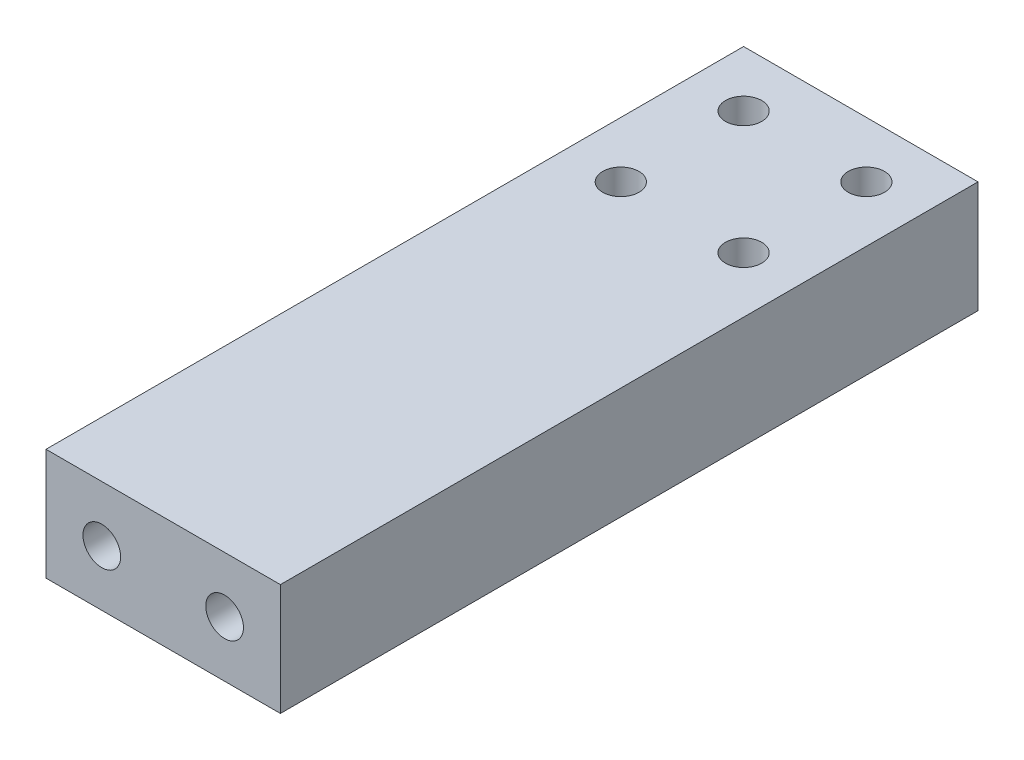
ISO-10303-21;
HEADER;
FILE_DESCRIPTION(('STEP AP214'),'2;1');
FILE_NAME('part.step','',(''),(''),'','','');
FILE_SCHEMA(('AUTOMOTIVE_DESIGN { 1 0 10303 214 1 1 1 1 }'));
ENDSEC;
DATA;
#1=APPLICATION_CONTEXT('core data for automotive mechanical design processes');
#2=APPLICATION_PROTOCOL_DEFINITION('international standard','automotive_design',2000,#1);
#3=PRODUCT_CONTEXT('',#1,'mechanical');
#4=PRODUCT('Part','Part','',(#3));
#5=PRODUCT_RELATED_PRODUCT_CATEGORY('part','',(#4));
#6=PRODUCT_DEFINITION_FORMATION('','',#4);
#7=PRODUCT_DEFINITION_CONTEXT('part definition',#1,'design');
#8=PRODUCT_DEFINITION('design','',#6,#7);
#9=PRODUCT_DEFINITION_SHAPE('','',#8);
#10=(LENGTH_UNIT() NAMED_UNIT(*) SI_UNIT(.MILLI.,.METRE.));
#11=(NAMED_UNIT(*) PLANE_ANGLE_UNIT() SI_UNIT($,.RADIAN.));
#12=(NAMED_UNIT(*) SI_UNIT($,.STERADIAN.) SOLID_ANGLE_UNIT());
#13=UNCERTAINTY_MEASURE_WITH_UNIT(LENGTH_MEASURE(1.E-05),#10,'distance_accuracy_value','');
#14=(GEOMETRIC_REPRESENTATION_CONTEXT(3) GLOBAL_UNCERTAINTY_ASSIGNED_CONTEXT((#13)) GLOBAL_UNIT_ASSIGNED_CONTEXT((#10,
#11,#12)) REPRESENTATION_CONTEXT('',''));
#15=CARTESIAN_POINT('',(0.,0.,0.));
#16=DIRECTION('',(0.,0.,1.));
#17=DIRECTION('',(1.,0.,0.));
#18=AXIS2_PLACEMENT_3D('',#15,#16,#17);
#19=CARTESIAN_POINT('',(0.,0.,125.));
#20=DIRECTION('',(1.,0.,0.));
#21=DIRECTION('',(0.,0.,-1.));
#22=AXIS2_PLACEMENT_3D('',#19,#20,#21);
#23=PLANE('',#22);
#24=DIRECTION('',(0.,-1.,0.));
#25=VECTOR('',#24,1.);
#26=CARTESIAN_POINT('',(0.,0.,0.));
#27=LINE('',#26,#25);
#28=CARTESIAN_POINT('',(0.,20.,0.));
#29=VERTEX_POINT('',#28);
#30=CARTESIAN_POINT('',(0.,0.,0.));
#31=VERTEX_POINT('',#30);
#32=EDGE_CURVE('E77',#29,#31,#27,.T.);
#33=ORIENTED_EDGE('',*,*,#32,.T.);
#34=DIRECTION('',(0.,0.,-1.));
#35=VECTOR('',#34,1.);
#36=CARTESIAN_POINT('',(0.,0.,125.));
#37=LINE('',#36,#35);
#38=CARTESIAN_POINT('',(0.,0.,125.));
#39=VERTEX_POINT('',#38);
#40=EDGE_CURVE('E11',#39,#31,#37,.T.);
#41=ORIENTED_EDGE('',*,*,#40,.F.);
#42=DIRECTION('',(0.,-1.,0.));
#43=VECTOR('',#42,1.);
#44=CARTESIAN_POINT('',(0.,0.,125.));
#45=LINE('',#44,#43);
#46=CARTESIAN_POINT('',(0.,20.,125.));
#47=VERTEX_POINT('',#46);
#48=EDGE_CURVE('E100',#47,#39,#45,.T.);
#49=ORIENTED_EDGE('',*,*,#48,.F.);
#50=DIRECTION('',(0.,0.,-1.));
#51=VECTOR('',#50,1.);
#52=CARTESIAN_POINT('',(0.,20.,125.));
#53=LINE('',#52,#51);
#54=EDGE_CURVE('E89',#47,#29,#53,.T.);
#55=ORIENTED_EDGE('',*,*,#54,.T.);
#56=EDGE_LOOP('',(#33,#41,#49,#55));
#57=FACE_BOUND('',#56,.T.);
#58=ADVANCED_FACE('F33',(#57),#23,.F.);
#59=CARTESIAN_POINT('',(0.,0.,125.));
#60=DIRECTION('',(0.,1.,0.));
#61=DIRECTION('',(0.,0.,1.));
#62=AXIS2_PLACEMENT_3D('',#59,#60,#61);
#63=PLANE('',#62);
#64=CARTESIAN_POINT('',(32.0000000000001,0.,31.9999999999998));
#65=DIRECTION('',(0.,1.,0.));
#66=DIRECTION('',(0.,0.,1.));
#67=AXIS2_PLACEMENT_3D('',#64,#65,#66);
#68=CIRCLE('',#67,3.25);
#69=CARTESIAN_POINT('',(32.0000000000001,0.,35.2499999999998));
#70=VERTEX_POINT('',#69);
#71=EDGE_CURVE('E138',#70,#70,#68,.F.);
#72=ORIENTED_EDGE('',*,*,#71,.F.);
#73=EDGE_LOOP('',(#72));
#74=FACE_BOUND('',#73,.T.);
#75=CARTESIAN_POINT('',(10.0000000000001,0.,32.));
#76=DIRECTION('',(0.,1.,0.));
#77=DIRECTION('',(0.,0.,1.));
#78=AXIS2_PLACEMENT_3D('',#75,#76,#77);
#79=CIRCLE('',#78,3.25);
#80=CARTESIAN_POINT('',(10.0000000000001,0.,35.25));
#81=VERTEX_POINT('',#80);
#82=EDGE_CURVE('E142',#81,#81,#79,.F.);
#83=ORIENTED_EDGE('',*,*,#82,.F.);
#84=EDGE_LOOP('',(#83));
#85=FACE_BOUND('',#84,.T.);
#86=CARTESIAN_POINT('',(32.,0.,9.99999999999984));
#87=DIRECTION('',(0.,1.,0.));
#88=DIRECTION('',(0.,0.,1.));
#89=AXIS2_PLACEMENT_3D('',#86,#87,#88);
#90=CIRCLE('',#89,3.25);
#91=CARTESIAN_POINT('',(32.,0.,13.2499999999998));
#92=VERTEX_POINT('',#91);
#93=EDGE_CURVE('E146',#92,#92,#90,.F.);
#94=ORIENTED_EDGE('',*,*,#93,.F.);
#95=EDGE_LOOP('',(#94));
#96=FACE_BOUND('',#95,.T.);
#97=CARTESIAN_POINT('',(10.,0.,9.99999999999999));
#98=DIRECTION('',(0.,1.,0.));
#99=DIRECTION('',(0.,0.,1.));
#100=AXIS2_PLACEMENT_3D('',#97,#98,#99);
#101=CIRCLE('',#100,3.25);
#102=CARTESIAN_POINT('',(10.,0.,13.25));
#103=VERTEX_POINT('',#102);
#104=EDGE_CURVE('E90',#103,#103,#101,.F.);
#105=ORIENTED_EDGE('',*,*,#104,.F.);
#106=EDGE_LOOP('',(#105));
#107=FACE_BOUND('',#106,.T.);
#108=DIRECTION('',(1.,0.,0.));
#109=VECTOR('',#108,1.);
#110=CARTESIAN_POINT('',(0.,0.,0.));
#111=LINE('',#110,#109);
#112=CARTESIAN_POINT('',(42.,0.,0.));
#113=VERTEX_POINT('',#112);
#114=EDGE_CURVE('E73',#31,#113,#111,.T.);
#115=ORIENTED_EDGE('',*,*,#114,.T.);
#116=DIRECTION('',(0.,0.,-1.));
#117=VECTOR('',#116,1.);
#118=CARTESIAN_POINT('',(42.,0.,125.));
#119=LINE('',#118,#117);
#120=CARTESIAN_POINT('',(42.,0.,125.));
#121=VERTEX_POINT('',#120);
#122=EDGE_CURVE('E40',#121,#113,#119,.T.);
#123=ORIENTED_EDGE('',*,*,#122,.F.);
#124=DIRECTION('',(1.,0.,0.));
#125=VECTOR('',#124,1.);
#126=CARTESIAN_POINT('',(0.,0.,125.));
#127=LINE('',#126,#125);
#128=EDGE_CURVE('E85',#39,#121,#127,.T.);
#129=ORIENTED_EDGE('',*,*,#128,.F.);
#130=ORIENTED_EDGE('',*,*,#40,.T.);
#131=EDGE_LOOP('',(#115,#123,#129,#130));
#132=FACE_BOUND('',#131,.T.);
#133=ADVANCED_FACE('F84',(#74,#85,#96,#107,#132),#63,.F.);
#134=CARTESIAN_POINT('',(42.,0.,125.));
#135=DIRECTION('',(-1.,0.,0.));
#136=DIRECTION('',(0.,0.,1.));
#137=AXIS2_PLACEMENT_3D('',#134,#135,#136);
#138=PLANE('',#137);
#139=DIRECTION('',(0.,1.,0.));
#140=VECTOR('',#139,1.);
#141=CARTESIAN_POINT('',(42.,0.,0.));
#142=LINE('',#141,#140);
#143=CARTESIAN_POINT('',(42.,20.,0.));
#144=VERTEX_POINT('',#143);
#145=EDGE_CURVE('E78',#113,#144,#142,.T.);
#146=ORIENTED_EDGE('',*,*,#145,.T.);
#147=DIRECTION('',(0.,0.,-1.));
#148=VECTOR('',#147,1.);
#149=CARTESIAN_POINT('',(42.,20.,125.));
#150=LINE('',#149,#148);
#151=CARTESIAN_POINT('',(42.,20.,125.));
#152=VERTEX_POINT('',#151);
#153=EDGE_CURVE('E106',#152,#144,#150,.T.);
#154=ORIENTED_EDGE('',*,*,#153,.F.);
#155=DIRECTION('',(0.,1.,0.));
#156=VECTOR('',#155,1.);
#157=CARTESIAN_POINT('',(42.,0.,125.));
#158=LINE('',#157,#156);
#159=EDGE_CURVE('E52',#121,#152,#158,.T.);
#160=ORIENTED_EDGE('',*,*,#159,.F.);
#161=ORIENTED_EDGE('',*,*,#122,.T.);
#162=EDGE_LOOP('',(#146,#154,#160,#161));
#163=FACE_BOUND('',#162,.T.);
#164=ADVANCED_FACE('F109',(#163),#138,.F.);
#165=CARTESIAN_POINT('',(0.,20.,125.));
#166=DIRECTION('',(0.,-1.,0.));
#167=DIRECTION('',(0.,0.,-1.));
#168=AXIS2_PLACEMENT_3D('',#165,#166,#167);
#169=PLANE('',#168);
#170=CARTESIAN_POINT('',(32.0000000000001,20.,31.9999999999998));
#171=DIRECTION('',(0.,1.,0.));
#172=DIRECTION('',(0.,0.,1.));
#173=AXIS2_PLACEMENT_3D('',#170,#171,#172);
#174=CIRCLE('',#173,3.25);
#175=CARTESIAN_POINT('',(32.0000000000001,20.,35.2499999999998));
#176=VERTEX_POINT('',#175);
#177=EDGE_CURVE('E199',#176,#176,#174,.T.);
#178=ORIENTED_EDGE('',*,*,#177,.F.);
#179=EDGE_LOOP('',(#178));
#180=FACE_BOUND('',#179,.T.);
#181=CARTESIAN_POINT('',(10.0000000000001,20.,32.));
#182=DIRECTION('',(0.,1.,0.));
#183=DIRECTION('',(0.,0.,1.));
#184=AXIS2_PLACEMENT_3D('',#181,#182,#183);
#185=CIRCLE('',#184,3.25);
#186=CARTESIAN_POINT('',(10.0000000000001,20.,35.25));
#187=VERTEX_POINT('',#186);
#188=EDGE_CURVE('E203',#187,#187,#185,.T.);
#189=ORIENTED_EDGE('',*,*,#188,.F.);
#190=EDGE_LOOP('',(#189));
#191=FACE_BOUND('',#190,.T.);
#192=CARTESIAN_POINT('',(32.,20.,9.99999999999984));
#193=DIRECTION('',(0.,1.,0.));
#194=DIRECTION('',(0.,0.,1.));
#195=AXIS2_PLACEMENT_3D('',#192,#193,#194);
#196=CIRCLE('',#195,3.25);
#197=CARTESIAN_POINT('',(32.,20.,13.2499999999998));
#198=VERTEX_POINT('',#197);
#199=EDGE_CURVE('E207',#198,#198,#196,.T.);
#200=ORIENTED_EDGE('',*,*,#199,.F.);
#201=EDGE_LOOP('',(#200));
#202=FACE_BOUND('',#201,.T.);
#203=CARTESIAN_POINT('',(10.,20.,9.99999999999999));
#204=DIRECTION('',(0.,1.,0.));
#205=DIRECTION('',(0.,0.,1.));
#206=AXIS2_PLACEMENT_3D('',#203,#204,#205);
#207=CIRCLE('',#206,3.25);
#208=CARTESIAN_POINT('',(10.,20.,13.25));
#209=VERTEX_POINT('',#208);
#210=EDGE_CURVE('E93',#209,#209,#207,.T.);
#211=ORIENTED_EDGE('',*,*,#210,.F.);
#212=EDGE_LOOP('',(#211));
#213=FACE_BOUND('',#212,.T.);
#214=DIRECTION('',(-1.,0.,0.));
#215=VECTOR('',#214,1.);
#216=CARTESIAN_POINT('',(0.,20.,0.));
#217=LINE('',#216,#215);
#218=EDGE_CURVE('E98',#144,#29,#217,.T.);
#219=ORIENTED_EDGE('',*,*,#218,.T.);
#220=ORIENTED_EDGE('',*,*,#54,.F.);
#221=DIRECTION('',(-1.,0.,0.));
#222=VECTOR('',#221,1.);
#223=CARTESIAN_POINT('',(0.,20.,125.));
#224=LINE('',#223,#222);
#225=EDGE_CURVE('E47',#152,#47,#224,.T.);
#226=ORIENTED_EDGE('',*,*,#225,.F.);
#227=ORIENTED_EDGE('',*,*,#153,.T.);
#228=EDGE_LOOP('',(#219,#220,#226,#227));
#229=FACE_BOUND('',#228,.T.);
#230=ADVANCED_FACE('F111',(#180,#191,#202,#213,#229),#169,.F.);
#231=CARTESIAN_POINT('',(0.,20.,125.));
#232=DIRECTION('',(0.,0.,-1.));
#233=DIRECTION('',(-1.,0.,0.));
#234=AXIS2_PLACEMENT_3D('',#231,#232,#233);
#235=PLANE('',#234);
#236=CARTESIAN_POINT('',(32.,10.,125.));
#237=DIRECTION('',(0.,0.,1.));
#238=DIRECTION('',(1.,0.,0.));
#239=AXIS2_PLACEMENT_3D('',#236,#237,#238);
#240=CIRCLE('',#239,3.375);
#241=CARTESIAN_POINT('',(35.375,10.,125.));
#242=VERTEX_POINT('',#241);
#243=EDGE_CURVE('E189',#242,#242,#240,.T.);
#244=ORIENTED_EDGE('',*,*,#243,.F.);
#245=EDGE_LOOP('',(#244));
#246=FACE_BOUND('',#245,.T.);
#247=CARTESIAN_POINT('',(10.,10.,125.));
#248=DIRECTION('',(0.,0.,1.));
#249=DIRECTION('',(1.,0.,0.));
#250=AXIS2_PLACEMENT_3D('',#247,#248,#249);
#251=CIRCLE('',#250,3.375);
#252=CARTESIAN_POINT('',(13.375,10.,125.));
#253=VERTEX_POINT('',#252);
#254=EDGE_CURVE('E188',#253,#253,#251,.T.);
#255=ORIENTED_EDGE('',*,*,#254,.F.);
#256=EDGE_LOOP('',(#255));
#257=FACE_BOUND('',#256,.T.);
#258=ORIENTED_EDGE('',*,*,#48,.T.);
#259=ORIENTED_EDGE('',*,*,#128,.T.);
#260=ORIENTED_EDGE('',*,*,#159,.T.);
#261=ORIENTED_EDGE('',*,*,#225,.T.);
#262=EDGE_LOOP('',(#258,#259,#260,#261));
#263=FACE_BOUND('',#262,.T.);
#264=ADVANCED_FACE('F112',(#246,#257,#263),#235,.F.);
#265=CARTESIAN_POINT('',(0.,20.,0.));
#266=DIRECTION('',(0.,0.,-1.));
#267=DIRECTION('',(-1.,0.,0.));
#268=AXIS2_PLACEMENT_3D('',#265,#266,#267);
#269=PLANE('',#268);
#270=ORIENTED_EDGE('',*,*,#32,.F.);
#271=ORIENTED_EDGE('',*,*,#218,.F.);
#272=ORIENTED_EDGE('',*,*,#145,.F.);
#273=ORIENTED_EDGE('',*,*,#114,.F.);
#274=EDGE_LOOP('',(#270,#271,#272,#273));
#275=FACE_BOUND('',#274,.T.);
#276=ADVANCED_FACE('F74',(#275),#269,.T.);
#277=CARTESIAN_POINT('',(10.,-0.001000000000001,9.99999999999999));
#278=DIRECTION('',(0.,1.,0.));
#279=DIRECTION('',(0.,0.,1.));
#280=AXIS2_PLACEMENT_3D('',#277,#278,#279);
#281=CYLINDRICAL_SURFACE('',#280,3.25);
#282=ORIENTED_EDGE('',*,*,#210,.T.);
#283=EDGE_LOOP('',(#282));
#284=FACE_BOUND('',#283,.T.);
#285=ORIENTED_EDGE('',*,*,#104,.T.);
#286=EDGE_LOOP('',(#285));
#287=FACE_BOUND('',#286,.T.);
#288=ADVANCED_FACE('F120',(#284,#287),#281,.F.);
#289=CARTESIAN_POINT('',(32.,-0.001000000000001,9.99999999999984));
#290=DIRECTION('',(0.,1.,0.));
#291=DIRECTION('',(0.,0.,1.));
#292=AXIS2_PLACEMENT_3D('',#289,#290,#291);
#293=CYLINDRICAL_SURFACE('',#292,3.25);
#294=ORIENTED_EDGE('',*,*,#199,.T.);
#295=EDGE_LOOP('',(#294));
#296=FACE_BOUND('',#295,.T.);
#297=ORIENTED_EDGE('',*,*,#93,.T.);
#298=EDGE_LOOP('',(#297));
#299=FACE_BOUND('',#298,.T.);
#300=ADVANCED_FACE('F150',(#296,#299),#293,.F.);
#301=CARTESIAN_POINT('',(10.0000000000001,-0.001000000000001,32.));
#302=DIRECTION('',(0.,1.,0.));
#303=DIRECTION('',(0.,0.,1.));
#304=AXIS2_PLACEMENT_3D('',#301,#302,#303);
#305=CYLINDRICAL_SURFACE('',#304,3.25);
#306=ORIENTED_EDGE('',*,*,#188,.T.);
#307=EDGE_LOOP('',(#306));
#308=FACE_BOUND('',#307,.T.);
#309=ORIENTED_EDGE('',*,*,#82,.T.);
#310=EDGE_LOOP('',(#309));
#311=FACE_BOUND('',#310,.T.);
#312=ADVANCED_FACE('F156',(#308,#311),#305,.F.);
#313=CARTESIAN_POINT('',(32.0000000000001,-0.001000000000001,31.9999999999998));
#314=DIRECTION('',(0.,1.,0.));
#315=DIRECTION('',(0.,0.,1.));
#316=AXIS2_PLACEMENT_3D('',#313,#314,#315);
#317=CYLINDRICAL_SURFACE('',#316,3.25);
#318=ORIENTED_EDGE('',*,*,#177,.T.);
#319=EDGE_LOOP('',(#318));
#320=FACE_BOUND('',#319,.T.);
#321=ORIENTED_EDGE('',*,*,#71,.T.);
#322=EDGE_LOOP('',(#321));
#323=FACE_BOUND('',#322,.T.);
#324=ADVANCED_FACE('F163',(#320,#323),#317,.F.);
#325=CARTESIAN_POINT('',(10.,10.,100.));
#326=DIRECTION('',(0.,0.,1.));
#327=DIRECTION('',(1.,0.,0.));
#328=AXIS2_PLACEMENT_3D('',#325,#326,#327);
#329=CYLINDRICAL_SURFACE('',#328,3.375);
#330=CARTESIAN_POINT('',(10.,10.,100.));
#331=DIRECTION('',(0.,0.,1.));
#332=DIRECTION('',(1.,0.,0.));
#333=AXIS2_PLACEMENT_3D('',#330,#331,#332);
#334=CIRCLE('',#333,3.375);
#335=CARTESIAN_POINT('',(13.375,10.,100.));
#336=VERTEX_POINT('',#335);
#337=EDGE_CURVE('E192',#336,#336,#334,.T.);
#338=ORIENTED_EDGE('',*,*,#337,.F.);
#339=EDGE_LOOP('',(#338));
#340=FACE_BOUND('',#339,.T.);
#341=ORIENTED_EDGE('',*,*,#254,.T.);
#342=EDGE_LOOP('',(#341));
#343=FACE_BOUND('',#342,.T.);
#344=ADVANCED_FACE('F167',(#340,#343),#329,.F.);
#345=CARTESIAN_POINT('',(10.,10.,100.));
#346=DIRECTION('',(0.,0.,1.));
#347=DIRECTION('',(1.,0.,0.));
#348=AXIS2_PLACEMENT_3D('',#345,#346,#347);
#349=PLANE('',#348);
#350=ORIENTED_EDGE('',*,*,#337,.T.);
#351=EDGE_LOOP('',(#350));
#352=FACE_BOUND('',#351,.T.);
#353=ADVANCED_FACE('F171',(#352),#349,.T.);
#354=CARTESIAN_POINT('',(32.,10.,100.));
#355=DIRECTION('',(0.,0.,1.));
#356=DIRECTION('',(1.,0.,0.));
#357=AXIS2_PLACEMENT_3D('',#354,#355,#356);
#358=CYLINDRICAL_SURFACE('',#357,3.375);
#359=CARTESIAN_POINT('',(32.,10.,100.));
#360=DIRECTION('',(0.,0.,1.));
#361=DIRECTION('',(1.,0.,0.));
#362=AXIS2_PLACEMENT_3D('',#359,#360,#361);
#363=CIRCLE('',#362,3.375);
#364=CARTESIAN_POINT('',(35.375,10.,100.));
#365=VERTEX_POINT('',#364);
#366=EDGE_CURVE('E187',#365,#365,#363,.T.);
#367=ORIENTED_EDGE('',*,*,#366,.F.);
#368=EDGE_LOOP('',(#367));
#369=FACE_BOUND('',#368,.T.);
#370=ORIENTED_EDGE('',*,*,#243,.T.);
#371=EDGE_LOOP('',(#370));
#372=FACE_BOUND('',#371,.T.);
#373=ADVANCED_FACE('F175',(#369,#372),#358,.F.);
#374=CARTESIAN_POINT('',(32.,10.,100.));
#375=DIRECTION('',(0.,0.,1.));
#376=DIRECTION('',(1.,0.,0.));
#377=AXIS2_PLACEMENT_3D('',#374,#375,#376);
#378=PLANE('',#377);
#379=ORIENTED_EDGE('',*,*,#366,.T.);
#380=EDGE_LOOP('',(#379));
#381=FACE_BOUND('',#380,.T.);
#382=ADVANCED_FACE('F179',(#381),#378,.T.);
#383=CLOSED_SHELL('',(#58,#133,#164,#230,#264,#276,#288,#300,#312,#324,#344,#353,#373,#382));
#384=MANIFOLD_SOLID_BREP('B2',#383);
#385=ADVANCED_BREP_SHAPE_REPRESENTATION('',(#18,#384),#14);
#386=SHAPE_DEFINITION_REPRESENTATION(#9,#385);
ENDSEC;
END-ISO-10303-21;
